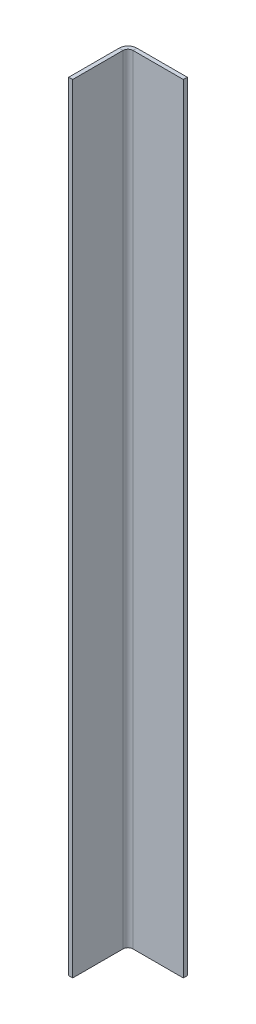
ISO-10303-21;
HEADER;
FILE_DESCRIPTION(('STEP AP214'),'2;1');
FILE_NAME('part.step','',(''),(''),'','','');
FILE_SCHEMA(('AUTOMOTIVE_DESIGN { 1 0 10303 214 1 1 1 1 }'));
ENDSEC;
DATA;
#1=APPLICATION_CONTEXT('core data for automotive mechanical design processes');
#2=APPLICATION_PROTOCOL_DEFINITION('international standard','automotive_design',2000,#1);
#3=PRODUCT_CONTEXT('',#1,'mechanical');
#4=PRODUCT('Part','Part','',(#3));
#5=PRODUCT_RELATED_PRODUCT_CATEGORY('part','',(#4));
#6=PRODUCT_DEFINITION_FORMATION('','',#4);
#7=PRODUCT_DEFINITION_CONTEXT('part definition',#1,'design');
#8=PRODUCT_DEFINITION('design','',#6,#7);
#9=PRODUCT_DEFINITION_SHAPE('','',#8);
#10=(LENGTH_UNIT() NAMED_UNIT(*) SI_UNIT(.MILLI.,.METRE.));
#11=(NAMED_UNIT(*) PLANE_ANGLE_UNIT() SI_UNIT($,.RADIAN.));
#12=(NAMED_UNIT(*) SI_UNIT($,.STERADIAN.) SOLID_ANGLE_UNIT());
#13=UNCERTAINTY_MEASURE_WITH_UNIT(LENGTH_MEASURE(1.E-05),#10,'distance_accuracy_value','');
#14=(GEOMETRIC_REPRESENTATION_CONTEXT(3) GLOBAL_UNCERTAINTY_ASSIGNED_CONTEXT((#13)) GLOBAL_UNIT_ASSIGNED_CONTEXT((#10,
#11,#12)) REPRESENTATION_CONTEXT('',''));
#15=CARTESIAN_POINT('',(0.,0.,0.));
#16=DIRECTION('',(0.,0.,1.));
#17=DIRECTION('',(1.,0.,0.));
#18=AXIS2_PLACEMENT_3D('',#15,#16,#17);
#19=CARTESIAN_POINT('',(-2.,197.,15.));
#20=DIRECTION('',(0.,1.,0.));
#21=DIRECTION('',(0.,0.,1.));
#22=AXIS2_PLACEMENT_3D('',#19,#20,#21);
#23=PLANE('',#22);
#24=DIRECTION('',(0.,0.,1.));
#25=VECTOR('',#24,1.);
#26=CARTESIAN_POINT('',(0.,197.,15.));
#27=LINE('',#26,#25);
#28=CARTESIAN_POINT('',(0.,197.,-10.5));
#29=VERTEX_POINT('',#28);
#30=CARTESIAN_POINT('',(0.,197.,15.));
#31=VERTEX_POINT('',#30);
#32=EDGE_CURVE('E103',#29,#31,#27,.T.);
#33=ORIENTED_EDGE('',*,*,#32,.F.);
#34=DIRECTION('',(-1.,0.,0.));
#35=VECTOR('',#34,1.);
#36=CARTESIAN_POINT('',(0.,197.,-10.5));
#37=LINE('',#36,#35);
#38=CARTESIAN_POINT('',(-2.00000000000001,197.,-10.5));
#39=VERTEX_POINT('',#38);
#40=EDGE_CURVE('E116',#29,#39,#37,.T.);
#41=ORIENTED_EDGE('',*,*,#40,.T.);
#42=DIRECTION('',(0.,0.,1.));
#43=VECTOR('',#42,1.);
#44=CARTESIAN_POINT('',(-2.,197.,15.));
#45=LINE('',#44,#43);
#46=CARTESIAN_POINT('',(-2.,197.,15.));
#47=VERTEX_POINT('',#46);
#48=EDGE_CURVE('E108',#39,#47,#45,.T.);
#49=ORIENTED_EDGE('',*,*,#48,.T.);
#50=DIRECTION('',(1.,0.,0.));
#51=VECTOR('',#50,1.);
#52=CARTESIAN_POINT('',(-2.,197.,15.));
#53=LINE('',#52,#51);
#54=EDGE_CURVE('E58',#47,#31,#53,.T.);
#55=ORIENTED_EDGE('',*,*,#54,.T.);
#56=EDGE_LOOP('',(#33,#41,#49,#55));
#57=FACE_BOUND('',#56,.T.);
#58=ADVANCED_FACE('F55',(#57),#23,.T.);
#59=CARTESIAN_POINT('',(-2.,0.,0.));
#60=DIRECTION('',(-1.,0.,0.));
#61=DIRECTION('',(0.,0.,1.));
#62=AXIS2_PLACEMENT_3D('',#59,#60,#61);
#63=PLANE('',#62);
#64=ORIENTED_EDGE('',*,*,#48,.F.);
#65=DIRECTION('',(0.,1.,0.));
#66=VECTOR('',#65,1.);
#67=CARTESIAN_POINT('',(-2.00000000000001,197.,-10.5));
#68=LINE('',#67,#66);
#69=CARTESIAN_POINT('',(-2.,-197.,-10.5));
#70=VERTEX_POINT('',#69);
#71=EDGE_CURVE('E133',#39,#70,#68,.F.);
#72=ORIENTED_EDGE('',*,*,#71,.T.);
#73=DIRECTION('',(0.,0.,-1.));
#74=VECTOR('',#73,1.);
#75=CARTESIAN_POINT('',(-2.,-197.,15.));
#76=LINE('',#75,#74);
#77=CARTESIAN_POINT('',(-2.,-197.,15.));
#78=VERTEX_POINT('',#77);
#79=EDGE_CURVE('E113',#78,#70,#76,.T.);
#80=ORIENTED_EDGE('',*,*,#79,.F.);
#81=DIRECTION('',(0.,-1.,0.));
#82=VECTOR('',#81,1.);
#83=CARTESIAN_POINT('',(-2.,-197.,15.));
#84=LINE('',#83,#82);
#85=EDGE_CURVE('E93',#47,#78,#84,.T.);
#86=ORIENTED_EDGE('',*,*,#85,.F.);
#87=EDGE_LOOP('',(#64,#72,#80,#86));
#88=FACE_BOUND('',#87,.T.);
#89=ADVANCED_FACE('F223',(#88),#63,.T.);
#90=CARTESIAN_POINT('',(0.,0.,0.));
#91=DIRECTION('',(-1.,0.,0.));
#92=DIRECTION('',(0.,0.,1.));
#93=AXIS2_PLACEMENT_3D('',#90,#91,#92);
#94=PLANE('',#93);
#95=DIRECTION('',(0.,1.,0.));
#96=VECTOR('',#95,1.);
#97=CARTESIAN_POINT('',(0.,197.,-10.5));
#98=LINE('',#97,#96);
#99=CARTESIAN_POINT('',(0.,-197.,-10.5));
#100=VERTEX_POINT('',#99);
#101=EDGE_CURVE('E123',#29,#100,#98,.F.);
#102=ORIENTED_EDGE('',*,*,#101,.F.);
#103=ORIENTED_EDGE('',*,*,#32,.T.);
#104=DIRECTION('',(0.,-1.,0.));
#105=VECTOR('',#104,1.);
#106=CARTESIAN_POINT('',(0.,-197.,15.));
#107=LINE('',#106,#105);
#108=CARTESIAN_POINT('',(0.,-197.,15.));
#109=VERTEX_POINT('',#108);
#110=EDGE_CURVE('E91',#31,#109,#107,.T.);
#111=ORIENTED_EDGE('',*,*,#110,.T.);
#112=DIRECTION('',(0.,0.,-1.));
#113=VECTOR('',#112,1.);
#114=CARTESIAN_POINT('',(0.,-197.,15.));
#115=LINE('',#114,#113);
#116=EDGE_CURVE('E100',#109,#100,#115,.T.);
#117=ORIENTED_EDGE('',*,*,#116,.T.);
#118=EDGE_LOOP('',(#102,#103,#111,#117));
#119=FACE_BOUND('',#118,.T.);
#120=ADVANCED_FACE('F98',(#119),#94,.F.);
#121=CARTESIAN_POINT('',(-2.,-197.,15.));
#122=DIRECTION('',(0.,-1.,0.));
#123=DIRECTION('',(0.,0.,-1.));
#124=AXIS2_PLACEMENT_3D('',#121,#122,#123);
#125=PLANE('',#124);
#126=DIRECTION('',(-1.,0.,0.));
#127=VECTOR('',#126,1.);
#128=CARTESIAN_POINT('',(0.,-197.,-10.5));
#129=LINE('',#128,#127);
#130=EDGE_CURVE('E107',#100,#70,#129,.T.);
#131=ORIENTED_EDGE('',*,*,#130,.F.);
#132=ORIENTED_EDGE('',*,*,#116,.F.);
#133=DIRECTION('',(1.,0.,0.));
#134=VECTOR('',#133,1.);
#135=CARTESIAN_POINT('',(-2.,-197.,15.));
#136=LINE('',#135,#134);
#137=EDGE_CURVE('E13',#78,#109,#136,.T.);
#138=ORIENTED_EDGE('',*,*,#137,.F.);
#139=ORIENTED_EDGE('',*,*,#79,.T.);
#140=EDGE_LOOP('',(#131,#132,#138,#139));
#141=FACE_BOUND('',#140,.T.);
#142=ADVANCED_FACE('F106',(#141),#125,.T.);
#143=CARTESIAN_POINT('',(-2.,-197.,15.));
#144=DIRECTION('',(0.,0.,1.));
#145=DIRECTION('',(1.,0.,0.));
#146=AXIS2_PLACEMENT_3D('',#143,#144,#145);
#147=PLANE('',#146);
#148=ORIENTED_EDGE('',*,*,#110,.F.);
#149=ORIENTED_EDGE('',*,*,#54,.F.);
#150=ORIENTED_EDGE('',*,*,#85,.T.);
#151=ORIENTED_EDGE('',*,*,#137,.T.);
#152=EDGE_LOOP('',(#148,#149,#150,#151));
#153=FACE_BOUND('',#152,.T.);
#154=ADVANCED_FACE('F89',(#153),#147,.T.);
#155=CARTESIAN_POINT('',(2.49999999999999,-197.,-10.5));
#156=DIRECTION('',(0.,-1.,0.));
#157=DIRECTION('',(0.,0.,-1.));
#158=AXIS2_PLACEMENT_3D('',#155,#156,#157);
#159=PLANE('',#158);
#160=DIRECTION('',(0.,0.,1.));
#161=VECTOR('',#160,1.);
#162=CARTESIAN_POINT('',(2.49999999999999,-197.,-15.));
#163=LINE('',#162,#161);
#164=CARTESIAN_POINT('',(2.49999999999998,-197.,-13.));
#165=VERTEX_POINT('',#164);
#166=CARTESIAN_POINT('',(2.49999999999997,-197.,-15.));
#167=VERTEX_POINT('',#166);
#168=EDGE_CURVE('E137',#165,#167,#163,.F.);
#169=ORIENTED_EDGE('',*,*,#168,.F.);
#170=CARTESIAN_POINT('',(2.49999999999999,-197.,-10.5));
#171=DIRECTION('',(0.,1.,0.));
#172=DIRECTION('',(0.,0.,1.));
#173=AXIS2_PLACEMENT_3D('',#170,#171,#172);
#174=CIRCLE('',#173,2.5);
#175=EDGE_CURVE('E127',#100,#165,#174,.F.);
#176=ORIENTED_EDGE('',*,*,#175,.F.);
#177=ORIENTED_EDGE('',*,*,#130,.T.);
#178=CARTESIAN_POINT('',(2.49999999999999,-197.,-10.5));
#179=DIRECTION('',(0.,1.,0.));
#180=DIRECTION('',(0.,0.,1.));
#181=AXIS2_PLACEMENT_3D('',#178,#179,#180);
#182=CIRCLE('',#181,4.5);
#183=EDGE_CURVE('E69',#70,#167,#182,.F.);
#184=ORIENTED_EDGE('',*,*,#183,.T.);
#185=EDGE_LOOP('',(#169,#176,#177,#184));
#186=FACE_BOUND('',#185,.T.);
#187=ADVANCED_FACE('F225',(#186),#159,.T.);
#188=CARTESIAN_POINT('',(2.49999999999999,197.,-10.5));
#189=DIRECTION('',(0.,-1.,0.));
#190=DIRECTION('',(0.,0.,-1.));
#191=AXIS2_PLACEMENT_3D('',#188,#189,#190);
#192=PLANE('',#191);
#193=CARTESIAN_POINT('',(2.49999999999999,197.,-10.5));
#194=DIRECTION('',(0.,1.,0.));
#195=DIRECTION('',(0.,0.,1.));
#196=AXIS2_PLACEMENT_3D('',#193,#194,#195);
#197=CIRCLE('',#196,2.5);
#198=CARTESIAN_POINT('',(2.49999999999998,197.,-13.));
#199=VERTEX_POINT('',#198);
#200=EDGE_CURVE('E120',#199,#29,#197,.T.);
#201=ORIENTED_EDGE('',*,*,#200,.F.);
#202=DIRECTION('',(0.,0.,1.));
#203=VECTOR('',#202,1.);
#204=CARTESIAN_POINT('',(2.49999999999999,197.,-13.));
#205=LINE('',#204,#203);
#206=CARTESIAN_POINT('',(2.49999999999999,197.,-15.));
#207=VERTEX_POINT('',#206);
#208=EDGE_CURVE('E143',#199,#207,#205,.F.);
#209=ORIENTED_EDGE('',*,*,#208,.T.);
#210=CARTESIAN_POINT('',(2.49999999999999,197.,-10.5));
#211=DIRECTION('',(0.,1.,0.));
#212=DIRECTION('',(0.,0.,1.));
#213=AXIS2_PLACEMENT_3D('',#210,#211,#212);
#214=CIRCLE('',#213,4.5);
#215=EDGE_CURVE('E130',#207,#39,#214,.T.);
#216=ORIENTED_EDGE('',*,*,#215,.T.);
#217=ORIENTED_EDGE('',*,*,#40,.F.);
#218=EDGE_LOOP('',(#201,#209,#216,#217));
#219=FACE_BOUND('',#218,.T.);
#220=ADVANCED_FACE('F217',(#219),#192,.F.);
#221=CARTESIAN_POINT('',(2.49999999999999,197.,-10.5));
#222=DIRECTION('',(0.,1.,0.));
#223=DIRECTION('',(0.,0.,-1.));
#224=AXIS2_PLACEMENT_3D('',#221,#222,#223);
#225=CYLINDRICAL_SURFACE('',#224,4.5);
#226=ORIENTED_EDGE('',*,*,#71,.F.);
#227=ORIENTED_EDGE('',*,*,#215,.F.);
#228=DIRECTION('',(0.,1.,0.));
#229=VECTOR('',#228,1.);
#230=CARTESIAN_POINT('',(2.49999999999999,-197.,-15.));
#231=LINE('',#230,#229);
#232=EDGE_CURVE('E146',#207,#167,#231,.F.);
#233=ORIENTED_EDGE('',*,*,#232,.T.);
#234=ORIENTED_EDGE('',*,*,#183,.F.);
#235=EDGE_LOOP('',(#226,#227,#233,#234));
#236=FACE_BOUND('',#235,.T.);
#237=ADVANCED_FACE('F224',(#236),#225,.T.);
#238=CARTESIAN_POINT('',(2.49999999999999,197.,-10.5));
#239=DIRECTION('',(0.,1.,0.));
#240=DIRECTION('',(0.,0.,-1.));
#241=AXIS2_PLACEMENT_3D('',#238,#239,#240);
#242=CYLINDRICAL_SURFACE('',#241,2.5);
#243=ORIENTED_EDGE('',*,*,#101,.T.);
#244=ORIENTED_EDGE('',*,*,#175,.T.);
#245=DIRECTION('',(0.,1.,0.));
#246=VECTOR('',#245,1.);
#247=CARTESIAN_POINT('',(2.49999999999999,-197.,-13.));
#248=LINE('',#247,#246);
#249=EDGE_CURVE('E140',#165,#199,#248,.T.);
#250=ORIENTED_EDGE('',*,*,#249,.T.);
#251=ORIENTED_EDGE('',*,*,#200,.T.);
#252=EDGE_LOOP('',(#243,#244,#250,#251));
#253=FACE_BOUND('',#252,.T.);
#254=ADVANCED_FACE('F219',(#253),#242,.F.);
#255=CARTESIAN_POINT('',(28.,197.,-15.0000000000001));
#256=DIRECTION('',(0.,-1.,0.));
#257=DIRECTION('',(0.,0.,-1.));
#258=AXIS2_PLACEMENT_3D('',#255,#256,#257);
#259=PLANE('',#258);
#260=ORIENTED_EDGE('',*,*,#208,.F.);
#261=DIRECTION('',(-1.,0.,0.));
#262=VECTOR('',#261,1.);
#263=CARTESIAN_POINT('',(28.,197.,-13.0000000000001));
#264=LINE('',#263,#262);
#265=CARTESIAN_POINT('',(28.,197.,-13.0000000000001));
#266=VERTEX_POINT('',#265);
#267=EDGE_CURVE('E148',#199,#266,#264,.F.);
#268=ORIENTED_EDGE('',*,*,#267,.T.);
#269=DIRECTION('',(0.,0.,1.));
#270=VECTOR('',#269,1.);
#271=CARTESIAN_POINT('',(28.,197.,-15.0000000000001));
#272=LINE('',#271,#270);
#273=CARTESIAN_POINT('',(28.,197.,-15.0000000000001));
#274=VERTEX_POINT('',#273);
#275=EDGE_CURVE('E124',#274,#266,#272,.T.);
#276=ORIENTED_EDGE('',*,*,#275,.F.);
#277=DIRECTION('',(1.,0.,0.));
#278=VECTOR('',#277,1.);
#279=CARTESIAN_POINT('',(0.,197.,-15.));
#280=LINE('',#279,#278);
#281=EDGE_CURVE('E157',#207,#274,#280,.T.);
#282=ORIENTED_EDGE('',*,*,#281,.F.);
#283=EDGE_LOOP('',(#260,#268,#276,#282));
#284=FACE_BOUND('',#283,.T.);
#285=ADVANCED_FACE('F214',(#284),#259,.F.);
#286=CARTESIAN_POINT('',(0.,-197.,-15.));
#287=DIRECTION('',(0.,1.,0.));
#288=DIRECTION('',(0.,0.,1.));
#289=AXIS2_PLACEMENT_3D('',#286,#287,#288);
#290=PLANE('',#289);
#291=ORIENTED_EDGE('',*,*,#168,.T.);
#292=DIRECTION('',(-1.,0.,0.));
#293=VECTOR('',#292,1.);
#294=CARTESIAN_POINT('',(0.,-197.,-15.));
#295=LINE('',#294,#293);
#296=CARTESIAN_POINT('',(28.,-197.,-15.0000000000001));
#297=VERTEX_POINT('',#296);
#298=EDGE_CURVE('E163',#297,#167,#295,.T.);
#299=ORIENTED_EDGE('',*,*,#298,.F.);
#300=DIRECTION('',(0.,0.,1.));
#301=VECTOR('',#300,1.);
#302=CARTESIAN_POINT('',(28.,-197.,-15.0000000000001));
#303=LINE('',#302,#301);
#304=CARTESIAN_POINT('',(28.,-197.,-13.0000000000001));
#305=VERTEX_POINT('',#304);
#306=EDGE_CURVE('E166',#297,#305,#303,.T.);
#307=ORIENTED_EDGE('',*,*,#306,.T.);
#308=DIRECTION('',(1.,0.,0.));
#309=VECTOR('',#308,1.);
#310=CARTESIAN_POINT('',(0.,-197.,-13.));
#311=LINE('',#310,#309);
#312=EDGE_CURVE('E154',#305,#165,#311,.F.);
#313=ORIENTED_EDGE('',*,*,#312,.T.);
#314=EDGE_LOOP('',(#291,#299,#307,#313));
#315=FACE_BOUND('',#314,.T.);
#316=ADVANCED_FACE('F192',(#315),#290,.F.);
#317=CARTESIAN_POINT('',(0.,0.,-15.));
#318=DIRECTION('',(0.,0.,1.));
#319=DIRECTION('',(1.,0.,0.));
#320=AXIS2_PLACEMENT_3D('',#317,#318,#319);
#321=PLANE('',#320);
#322=ORIENTED_EDGE('',*,*,#232,.F.);
#323=ORIENTED_EDGE('',*,*,#281,.T.);
#324=DIRECTION('',(0.,-1.,0.));
#325=VECTOR('',#324,1.);
#326=CARTESIAN_POINT('',(28.,0.,-15.0000000000001));
#327=LINE('',#326,#325);
#328=EDGE_CURVE('E160',#274,#297,#327,.T.);
#329=ORIENTED_EDGE('',*,*,#328,.T.);
#330=ORIENTED_EDGE('',*,*,#298,.T.);
#331=EDGE_LOOP('',(#322,#323,#329,#330));
#332=FACE_BOUND('',#331,.T.);
#333=ADVANCED_FACE('F212',(#332),#321,.F.);
#334=CARTESIAN_POINT('',(0.,0.,-13.));
#335=DIRECTION('',(0.,0.,1.));
#336=DIRECTION('',(1.,0.,0.));
#337=AXIS2_PLACEMENT_3D('',#334,#335,#336);
#338=PLANE('',#337);
#339=ORIENTED_EDGE('',*,*,#267,.F.);
#340=ORIENTED_EDGE('',*,*,#249,.F.);
#341=ORIENTED_EDGE('',*,*,#312,.F.);
#342=DIRECTION('',(0.,1.,0.));
#343=VECTOR('',#342,1.);
#344=CARTESIAN_POINT('',(28.,-197.,-13.0000000000001));
#345=LINE('',#344,#343);
#346=EDGE_CURVE('E151',#266,#305,#345,.F.);
#347=ORIENTED_EDGE('',*,*,#346,.F.);
#348=EDGE_LOOP('',(#339,#340,#341,#347));
#349=FACE_BOUND('',#348,.T.);
#350=ADVANCED_FACE('F186',(#349),#338,.T.);
#351=CARTESIAN_POINT('',(28.,-197.,-15.0000000000001));
#352=DIRECTION('',(-1.,0.,0.));
#353=DIRECTION('',(0.,0.,1.));
#354=AXIS2_PLACEMENT_3D('',#351,#352,#353);
#355=PLANE('',#354);
#356=ORIENTED_EDGE('',*,*,#346,.T.);
#357=ORIENTED_EDGE('',*,*,#306,.F.);
#358=ORIENTED_EDGE('',*,*,#328,.F.);
#359=ORIENTED_EDGE('',*,*,#275,.T.);
#360=EDGE_LOOP('',(#356,#357,#358,#359));
#361=FACE_BOUND('',#360,.T.);
#362=ADVANCED_FACE('F175',(#361),#355,.F.);
#363=CLOSED_SHELL('',(#58,#89,#120,#142,#154,#187,#220,#237,#254,#285,#316,#333,#350,#362));
#364=MANIFOLD_SOLID_BREP('B2',#363);
#365=ADVANCED_BREP_SHAPE_REPRESENTATION('',(#18,#364),#14);
#366=SHAPE_DEFINITION_REPRESENTATION(#9,#365);
ENDSEC;
END-ISO-10303-21;
